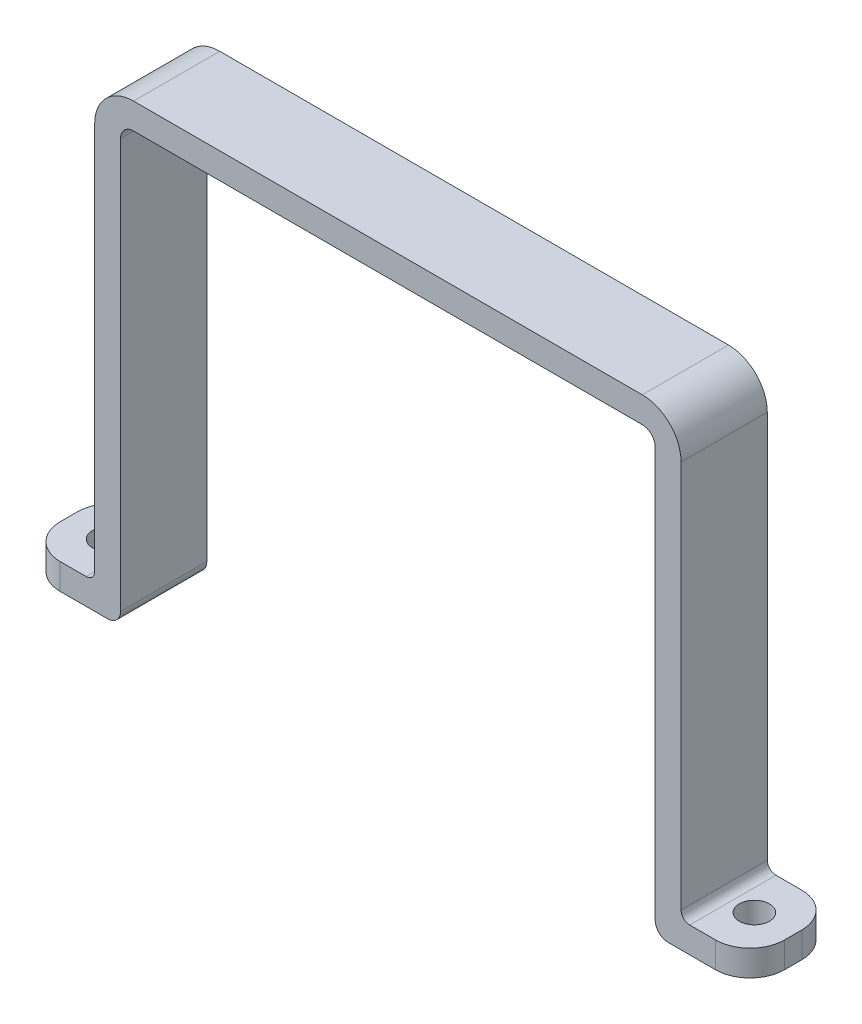
ISO-10303-21;
HEADER;
FILE_DESCRIPTION(('STEP AP214'),'2;1');
FILE_NAME('part.step','',(''),(''),'','','');
FILE_SCHEMA(('AUTOMOTIVE_DESIGN { 1 0 10303 214 1 1 1 1 }'));
ENDSEC;
DATA;
#1=APPLICATION_CONTEXT('core data for automotive mechanical design processes');
#2=APPLICATION_PROTOCOL_DEFINITION('international standard','automotive_design',2000,#1);
#3=PRODUCT_CONTEXT('',#1,'mechanical');
#4=PRODUCT('Part','Part','',(#3));
#5=PRODUCT_RELATED_PRODUCT_CATEGORY('part','',(#4));
#6=PRODUCT_DEFINITION_FORMATION('','',#4);
#7=PRODUCT_DEFINITION_CONTEXT('part definition',#1,'design');
#8=PRODUCT_DEFINITION('design','',#6,#7);
#9=PRODUCT_DEFINITION_SHAPE('','',#8);
#10=(LENGTH_UNIT() NAMED_UNIT(*) SI_UNIT(.MILLI.,.METRE.));
#11=(NAMED_UNIT(*) PLANE_ANGLE_UNIT() SI_UNIT($,.RADIAN.));
#12=(NAMED_UNIT(*) SI_UNIT($,.STERADIAN.) SOLID_ANGLE_UNIT());
#13=UNCERTAINTY_MEASURE_WITH_UNIT(LENGTH_MEASURE(1.E-05),#10,'distance_accuracy_value','');
#14=(GEOMETRIC_REPRESENTATION_CONTEXT(3) GLOBAL_UNCERTAINTY_ASSIGNED_CONTEXT((#13)) GLOBAL_UNIT_ASSIGNED_CONTEXT((#10,
#11,#12)) REPRESENTATION_CONTEXT('',''));
#15=CARTESIAN_POINT('',(0.,0.,0.));
#16=DIRECTION('',(0.,0.,1.));
#17=DIRECTION('',(1.,0.,0.));
#18=AXIS2_PLACEMENT_3D('',#15,#16,#17);
#19=CARTESIAN_POINT('',(0.,3.,5.));
#20=DIRECTION('',(1.,0.,0.));
#21=DIRECTION('',(0.,1.,0.));
#22=AXIS2_PLACEMENT_3D('',#19,#20,#21);
#23=PLANE('',#22);
#24=DIRECTION('',(0.,0.,-1.));
#25=VECTOR('',#24,1.);
#26=CARTESIAN_POINT('',(0.,3.,5.));
#27=LINE('',#26,#25);
#28=CARTESIAN_POINT('',(0.,3.,1.));
#29=VERTEX_POINT('',#28);
#30=CARTESIAN_POINT('',(0.,3.,-1.));
#31=VERTEX_POINT('',#30);
#32=EDGE_CURVE('E440',#29,#31,#27,.T.);
#33=ORIENTED_EDGE('',*,*,#32,.T.);
#34=DIRECTION('',(0.,-1.,0.));
#35=VECTOR('',#34,1.);
#36=CARTESIAN_POINT('',(0.,3.,-1.));
#37=LINE('',#36,#35);
#38=CARTESIAN_POINT('',(0.,0.,-1.));
#39=VERTEX_POINT('',#38);
#40=EDGE_CURVE('E225',#31,#39,#37,.T.);
#41=ORIENTED_EDGE('',*,*,#40,.T.);
#42=DIRECTION('',(0.,0.,-1.));
#43=VECTOR('',#42,1.);
#44=CARTESIAN_POINT('',(0.,0.,5.));
#45=LINE('',#44,#43);
#46=CARTESIAN_POINT('',(0.,0.,1.));
#47=VERTEX_POINT('',#46);
#48=EDGE_CURVE('E214',#47,#39,#45,.T.);
#49=ORIENTED_EDGE('',*,*,#48,.F.);
#50=DIRECTION('',(0.,-1.,0.));
#51=VECTOR('',#50,1.);
#52=CARTESIAN_POINT('',(0.,3.,1.));
#53=LINE('',#52,#51);
#54=EDGE_CURVE('E227',#47,#29,#53,.F.);
#55=ORIENTED_EDGE('',*,*,#54,.T.);
#56=EDGE_LOOP('',(#33,#41,#49,#55));
#57=FACE_BOUND('',#56,.T.);
#58=ADVANCED_FACE('F50',(#57),#23,.F.);
#59=CARTESIAN_POINT('',(0.,0.,5.));
#60=DIRECTION('',(0.,1.,0.));
#61=DIRECTION('',(0.,0.,1.));
#62=AXIS2_PLACEMENT_3D('',#59,#60,#61);
#63=PLANE('',#62);
#64=CARTESIAN_POINT('',(4.50000000000003,0.,0.));
#65=DIRECTION('',(0.,-1.,0.));
#66=DIRECTION('',(1.,0.,0.));
#67=AXIS2_PLACEMENT_3D('',#64,#65,#66);
#68=CIRCLE('',#67,1.75);
#69=CARTESIAN_POINT('',(6.25000000000003,0.,0.));
#70=VERTEX_POINT('',#69);
#71=EDGE_CURVE('E512',#70,#70,#68,.T.);
#72=ORIENTED_EDGE('',*,*,#71,.F.);
#73=EDGE_LOOP('',(#72));
#74=FACE_BOUND('',#73,.T.);
#75=DIRECTION('',(1.,0.,0.));
#76=VECTOR('',#75,1.);
#77=CARTESIAN_POINT('',(0.,0.,-5.));
#78=LINE('',#77,#76);
#79=CARTESIAN_POINT('',(4.,0.,-5.));
#80=VERTEX_POINT('',#79);
#81=CARTESIAN_POINT('',(9.5,0.,-5.));
#82=VERTEX_POINT('',#81);
#83=EDGE_CURVE('E491',#80,#82,#78,.T.);
#84=ORIENTED_EDGE('',*,*,#83,.T.);
#85=DIRECTION('',(0.,0.,-1.));
#86=VECTOR('',#85,1.);
#87=CARTESIAN_POINT('',(9.5,0.,5.));
#88=LINE('',#87,#86);
#89=CARTESIAN_POINT('',(9.5,0.,5.));
#90=VERTEX_POINT('',#89);
#91=EDGE_CURVE('E364',#82,#90,#88,.F.);
#92=ORIENTED_EDGE('',*,*,#91,.T.);
#93=DIRECTION('',(1.,0.,0.));
#94=VECTOR('',#93,1.);
#95=CARTESIAN_POINT('',(0.,0.,5.));
#96=LINE('',#95,#94);
#97=CARTESIAN_POINT('',(4.,0.,5.));
#98=VERTEX_POINT('',#97);
#99=EDGE_CURVE('E213',#98,#90,#96,.T.);
#100=ORIENTED_EDGE('',*,*,#99,.F.);
#101=CARTESIAN_POINT('',(4.,0.,1.));
#102=DIRECTION('',(0.,1.,0.));
#103=DIRECTION('',(0.,0.,1.));
#104=AXIS2_PLACEMENT_3D('',#101,#102,#103);
#105=CIRCLE('',#104,4.);
#106=EDGE_CURVE('E209',#98,#47,#105,.F.);
#107=ORIENTED_EDGE('',*,*,#106,.T.);
#108=ORIENTED_EDGE('',*,*,#48,.T.);
#109=CARTESIAN_POINT('',(4.,0.,-1.));
#110=DIRECTION('',(0.,1.,0.));
#111=DIRECTION('',(0.,0.,1.));
#112=AXIS2_PLACEMENT_3D('',#109,#110,#111);
#113=CIRCLE('',#112,4.);
#114=EDGE_CURVE('E223',#39,#80,#113,.F.);
#115=ORIENTED_EDGE('',*,*,#114,.T.);
#116=EDGE_LOOP('',(#84,#92,#100,#107,#108,#115));
#117=FACE_BOUND('',#116,.T.);
#118=ADVANCED_FACE('F215',(#74,#117),#63,.F.);
#119=CARTESIAN_POINT('',(11.,0.,5.));
#120=DIRECTION('',(-1.,0.,0.));
#121=DIRECTION('',(0.,0.,1.));
#122=AXIS2_PLACEMENT_3D('',#119,#120,#121);
#123=PLANE('',#122);
#124=DIRECTION('',(0.,1.,0.));
#125=VECTOR('',#124,1.);
#126=CARTESIAN_POINT('',(11.,0.,5.));
#127=LINE('',#126,#125);
#128=CARTESIAN_POINT('',(11.,1.5,5.));
#129=VERTEX_POINT('',#128);
#130=CARTESIAN_POINT('',(11.,49.,5.));
#131=VERTEX_POINT('',#130);
#132=EDGE_CURVE('E478',#129,#131,#127,.T.);
#133=ORIENTED_EDGE('',*,*,#132,.F.);
#134=DIRECTION('',(0.,0.,-1.));
#135=VECTOR('',#134,1.);
#136=CARTESIAN_POINT('',(11.,1.5,5.));
#137=LINE('',#136,#135);
#138=CARTESIAN_POINT('',(11.,1.5,-5.));
#139=VERTEX_POINT('',#138);
#140=EDGE_CURVE('E359',#129,#139,#137,.T.);
#141=ORIENTED_EDGE('',*,*,#140,.T.);
#142=DIRECTION('',(0.,1.,0.));
#143=VECTOR('',#142,1.);
#144=CARTESIAN_POINT('',(11.,0.,-5.));
#145=LINE('',#144,#143);
#146=CARTESIAN_POINT('',(11.,49.,-5.));
#147=VERTEX_POINT('',#146);
#148=EDGE_CURVE('E496',#139,#147,#145,.T.);
#149=ORIENTED_EDGE('',*,*,#148,.T.);
#150=DIRECTION('',(0.,0.,-1.));
#151=VECTOR('',#150,1.);
#152=CARTESIAN_POINT('',(11.,49.,5.));
#153=LINE('',#152,#151);
#154=EDGE_CURVE('E292',#147,#131,#153,.F.);
#155=ORIENTED_EDGE('',*,*,#154,.T.);
#156=EDGE_LOOP('',(#133,#141,#149,#155));
#157=FACE_BOUND('',#156,.T.);
#158=ADVANCED_FACE('F532',(#157),#123,.F.);
#159=CARTESIAN_POINT('',(11.,50.5,5.));
#160=DIRECTION('',(0.,1.,0.));
#161=DIRECTION('',(0.,0.,1.));
#162=AXIS2_PLACEMENT_3D('',#159,#160,#161);
#163=PLANE('',#162);
#164=DIRECTION('',(1.,0.,0.));
#165=VECTOR('',#164,1.);
#166=CARTESIAN_POINT('',(11.,50.5,5.));
#167=LINE('',#166,#165);
#168=CARTESIAN_POINT('',(12.5,50.5,5.));
#169=VERTEX_POINT('',#168);
#170=CARTESIAN_POINT('',(71.5,50.5,5.));
#171=VERTEX_POINT('',#170);
#172=EDGE_CURVE('E471',#169,#171,#167,.T.);
#173=ORIENTED_EDGE('',*,*,#172,.F.);
#174=DIRECTION('',(0.,0.,-1.));
#175=VECTOR('',#174,1.);
#176=CARTESIAN_POINT('',(12.5,50.5,-5.));
#177=LINE('',#176,#175);
#178=CARTESIAN_POINT('',(12.5,50.5,-5.));
#179=VERTEX_POINT('',#178);
#180=EDGE_CURVE('E286',#169,#179,#177,.T.);
#181=ORIENTED_EDGE('',*,*,#180,.T.);
#182=DIRECTION('',(1.,0.,0.));
#183=VECTOR('',#182,1.);
#184=CARTESIAN_POINT('',(11.,50.5,-5.));
#185=LINE('',#184,#183);
#186=CARTESIAN_POINT('',(71.5,50.5,-5.));
#187=VERTEX_POINT('',#186);
#188=EDGE_CURVE('E499',#179,#187,#185,.T.);
#189=ORIENTED_EDGE('',*,*,#188,.T.);
#190=DIRECTION('',(0.,0.,-1.));
#191=VECTOR('',#190,1.);
#192=CARTESIAN_POINT('',(71.5,50.5,5.));
#193=LINE('',#192,#191);
#194=EDGE_CURVE('E284',#187,#171,#193,.F.);
#195=ORIENTED_EDGE('',*,*,#194,.T.);
#196=EDGE_LOOP('',(#173,#181,#189,#195));
#197=FACE_BOUND('',#196,.T.);
#198=ADVANCED_FACE('F539',(#197),#163,.F.);
#199=CARTESIAN_POINT('',(73.,50.5,5.));
#200=DIRECTION('',(1.,0.,0.));
#201=DIRECTION('',(0.,0.,-1.));
#202=AXIS2_PLACEMENT_3D('',#199,#200,#201);
#203=PLANE('',#202);
#204=DIRECTION('',(0.,-1.,0.));
#205=VECTOR('',#204,1.);
#206=CARTESIAN_POINT('',(73.,50.5,-5.));
#207=LINE('',#206,#205);
#208=CARTESIAN_POINT('',(73.,49.,-5.));
#209=VERTEX_POINT('',#208);
#210=CARTESIAN_POINT('',(73.,1.5,-5.));
#211=VERTEX_POINT('',#210);
#212=EDGE_CURVE('E425',#209,#211,#207,.T.);
#213=ORIENTED_EDGE('',*,*,#212,.T.);
#214=DIRECTION('',(0.,0.,-1.));
#215=VECTOR('',#214,1.);
#216=CARTESIAN_POINT('',(73.,1.5,5.));
#217=LINE('',#216,#215);
#218=CARTESIAN_POINT('',(73.,1.5,5.));
#219=VERTEX_POINT('',#218);
#220=EDGE_CURVE('E353',#211,#219,#217,.F.);
#221=ORIENTED_EDGE('',*,*,#220,.T.);
#222=DIRECTION('',(0.,-1.,0.));
#223=VECTOR('',#222,1.);
#224=CARTESIAN_POINT('',(73.,50.5,5.));
#225=LINE('',#224,#223);
#226=CARTESIAN_POINT('',(73.,49.,5.));
#227=VERTEX_POINT('',#226);
#228=EDGE_CURVE('E469',#227,#219,#225,.T.);
#229=ORIENTED_EDGE('',*,*,#228,.F.);
#230=DIRECTION('',(0.,0.,-1.));
#231=VECTOR('',#230,1.);
#232=CARTESIAN_POINT('',(73.,49.,-5.));
#233=LINE('',#232,#231);
#234=EDGE_CURVE('E298',#227,#209,#233,.T.);
#235=ORIENTED_EDGE('',*,*,#234,.T.);
#236=EDGE_LOOP('',(#213,#221,#229,#235));
#237=FACE_BOUND('',#236,.T.);
#238=ADVANCED_FACE('F466',(#237),#203,.F.);
#239=CARTESIAN_POINT('',(73.,0.,5.));
#240=DIRECTION('',(0.,1.,0.));
#241=DIRECTION('',(0.,0.,1.));
#242=AXIS2_PLACEMENT_3D('',#239,#240,#241);
#243=PLANE('',#242);
#244=CARTESIAN_POINT('',(79.5,0.,0.));
#245=DIRECTION('',(0.,1.,0.));
#246=DIRECTION('',(-1.,0.,0.));
#247=AXIS2_PLACEMENT_3D('',#244,#245,#246);
#248=CIRCLE('',#247,1.75);
#249=CARTESIAN_POINT('',(77.75,0.,0.));
#250=VERTEX_POINT('',#249);
#251=EDGE_CURVE('E500',#250,#250,#248,.T.);
#252=ORIENTED_EDGE('',*,*,#251,.T.);
#253=EDGE_LOOP('',(#252));
#254=FACE_BOUND('',#253,.T.);
#255=DIRECTION('',(1.,0.,0.));
#256=VECTOR('',#255,1.);
#257=CARTESIAN_POINT('',(73.,0.,5.));
#258=LINE('',#257,#256);
#259=CARTESIAN_POINT('',(74.5,0.,5.));
#260=VERTEX_POINT('',#259);
#261=CARTESIAN_POINT('',(80.,0.,5.));
#262=VERTEX_POINT('',#261);
#263=EDGE_CURVE('E463',#260,#262,#258,.T.);
#264=ORIENTED_EDGE('',*,*,#263,.F.);
#265=DIRECTION('',(0.,0.,-1.));
#266=VECTOR('',#265,1.);
#267=CARTESIAN_POINT('',(74.5,0.,5.));
#268=LINE('',#267,#266);
#269=CARTESIAN_POINT('',(74.5,0.,-5.));
#270=VERTEX_POINT('',#269);
#271=EDGE_CURVE('E342',#260,#270,#268,.T.);
#272=ORIENTED_EDGE('',*,*,#271,.T.);
#273=DIRECTION('',(1.,0.,0.));
#274=VECTOR('',#273,1.);
#275=CARTESIAN_POINT('',(73.,0.,-5.));
#276=LINE('',#275,#274);
#277=CARTESIAN_POINT('',(80.,0.,-5.));
#278=VERTEX_POINT('',#277);
#279=EDGE_CURVE('E416',#270,#278,#276,.T.);
#280=ORIENTED_EDGE('',*,*,#279,.T.);
#281=CARTESIAN_POINT('',(80.,0.,-1.));
#282=DIRECTION('',(0.,1.,0.));
#283=DIRECTION('',(0.,0.,1.));
#284=AXIS2_PLACEMENT_3D('',#281,#282,#283);
#285=CIRCLE('',#284,4.);
#286=CARTESIAN_POINT('',(84.,0.,-1.));
#287=VERTEX_POINT('',#286);
#288=EDGE_CURVE('E285',#278,#287,#285,.F.);
#289=ORIENTED_EDGE('',*,*,#288,.T.);
#290=DIRECTION('',(0.,0.,-1.));
#291=VECTOR('',#290,1.);
#292=CARTESIAN_POINT('',(84.,0.,5.));
#293=LINE('',#292,#291);
#294=CARTESIAN_POINT('',(84.,0.,1.));
#295=VERTEX_POINT('',#294);
#296=EDGE_CURVE('E233',#295,#287,#293,.T.);
#297=ORIENTED_EDGE('',*,*,#296,.F.);
#298=CARTESIAN_POINT('',(80.,0.,1.));
#299=DIRECTION('',(0.,1.,0.));
#300=DIRECTION('',(0.,0.,1.));
#301=AXIS2_PLACEMENT_3D('',#298,#299,#300);
#302=CIRCLE('',#301,4.);
#303=EDGE_CURVE('E279',#295,#262,#302,.F.);
#304=ORIENTED_EDGE('',*,*,#303,.T.);
#305=EDGE_LOOP('',(#264,#272,#280,#289,#297,#304));
#306=FACE_BOUND('',#305,.T.);
#307=ADVANCED_FACE('F458',(#254,#306),#243,.F.);
#308=CARTESIAN_POINT('',(84.,0.,5.));
#309=DIRECTION('',(-1.,0.,0.));
#310=DIRECTION('',(0.,0.,1.));
#311=AXIS2_PLACEMENT_3D('',#308,#309,#310);
#312=PLANE('',#311);
#313=ORIENTED_EDGE('',*,*,#296,.T.);
#314=DIRECTION('',(0.,1.,0.));
#315=VECTOR('',#314,1.);
#316=CARTESIAN_POINT('',(84.,0.,-1.));
#317=LINE('',#316,#315);
#318=CARTESIAN_POINT('',(84.,3.,-1.));
#319=VERTEX_POINT('',#318);
#320=EDGE_CURVE('E266',#287,#319,#317,.T.);
#321=ORIENTED_EDGE('',*,*,#320,.T.);
#322=DIRECTION('',(0.,0.,-1.));
#323=VECTOR('',#322,1.);
#324=CARTESIAN_POINT('',(84.,3.,5.));
#325=LINE('',#324,#323);
#326=CARTESIAN_POINT('',(84.,3.,1.));
#327=VERTEX_POINT('',#326);
#328=EDGE_CURVE('E439',#327,#319,#325,.T.);
#329=ORIENTED_EDGE('',*,*,#328,.F.);
#330=DIRECTION('',(0.,1.,0.));
#331=VECTOR('',#330,1.);
#332=CARTESIAN_POINT('',(84.,0.,1.));
#333=LINE('',#332,#331);
#334=EDGE_CURVE('E264',#327,#295,#333,.F.);
#335=ORIENTED_EDGE('',*,*,#334,.T.);
#336=EDGE_LOOP('',(#313,#321,#329,#335));
#337=FACE_BOUND('',#336,.T.);
#338=ADVANCED_FACE('F449',(#337),#312,.F.);
#339=CARTESIAN_POINT('',(84.,3.,5.));
#340=DIRECTION('',(0.,-1.,0.));
#341=DIRECTION('',(1.,0.,0.));
#342=AXIS2_PLACEMENT_3D('',#339,#340,#341);
#343=PLANE('',#342);
#344=CARTESIAN_POINT('',(79.5,3.,0.));
#345=DIRECTION('',(0.,1.,0.));
#346=DIRECTION('',(-1.,0.,0.));
#347=AXIS2_PLACEMENT_3D('',#344,#345,#346);
#348=CIRCLE('',#347,1.75);
#349=CARTESIAN_POINT('',(77.75,3.,0.));
#350=VERTEX_POINT('',#349);
#351=EDGE_CURVE('E510',#350,#350,#348,.T.);
#352=ORIENTED_EDGE('',*,*,#351,.F.);
#353=EDGE_LOOP('',(#352));
#354=FACE_BOUND('',#353,.T.);
#355=DIRECTION('',(-1.,0.,0.));
#356=VECTOR('',#355,1.);
#357=CARTESIAN_POINT('',(84.,3.,-5.));
#358=LINE('',#357,#356);
#359=CARTESIAN_POINT('',(80.,3.,-5.));
#360=VERTEX_POINT('',#359);
#361=CARTESIAN_POINT('',(77.,3.,-5.));
#362=VERTEX_POINT('',#361);
#363=EDGE_CURVE('E411',#360,#362,#358,.T.);
#364=ORIENTED_EDGE('',*,*,#363,.T.);
#365=DIRECTION('',(0.,0.,-1.));
#366=VECTOR('',#365,1.);
#367=CARTESIAN_POINT('',(77.,3.,5.));
#368=LINE('',#367,#366);
#369=CARTESIAN_POINT('',(77.,3.,5.));
#370=VERTEX_POINT('',#369);
#371=EDGE_CURVE('E371',#362,#370,#368,.F.);
#372=ORIENTED_EDGE('',*,*,#371,.T.);
#373=DIRECTION('',(-1.,0.,0.));
#374=VECTOR('',#373,1.);
#375=CARTESIAN_POINT('',(84.,3.,5.));
#376=LINE('',#375,#374);
#377=CARTESIAN_POINT('',(80.,3.,5.));
#378=VERTEX_POINT('',#377);
#379=EDGE_CURVE('E393',#378,#370,#376,.T.);
#380=ORIENTED_EDGE('',*,*,#379,.F.);
#381=CARTESIAN_POINT('',(80.,3.,1.));
#382=DIRECTION('',(0.,-1.,0.));
#383=DIRECTION('',(1.,0.,0.));
#384=AXIS2_PLACEMENT_3D('',#381,#382,#383);
#385=CIRCLE('',#384,4.);
#386=EDGE_CURVE('E275',#378,#327,#385,.F.);
#387=ORIENTED_EDGE('',*,*,#386,.T.);
#388=ORIENTED_EDGE('',*,*,#328,.T.);
#389=CARTESIAN_POINT('',(80.,3.,-1.));
#390=DIRECTION('',(0.,-1.,0.));
#391=DIRECTION('',(1.,0.,0.));
#392=AXIS2_PLACEMENT_3D('',#389,#390,#391);
#393=CIRCLE('',#392,4.);
#394=EDGE_CURVE('E273',#319,#360,#393,.F.);
#395=ORIENTED_EDGE('',*,*,#394,.T.);
#396=EDGE_LOOP('',(#364,#372,#380,#387,#388,#395));
#397=FACE_BOUND('',#396,.T.);
#398=ADVANCED_FACE('F414',(#354,#397),#343,.F.);
#399=CARTESIAN_POINT('',(76.,3.,5.));
#400=DIRECTION('',(-1.,0.,0.));
#401=DIRECTION('',(0.,0.,1.));
#402=AXIS2_PLACEMENT_3D('',#399,#400,#401);
#403=PLANE('',#402);
#404=DIRECTION('',(0.,1.,0.));
#405=VECTOR('',#404,1.);
#406=CARTESIAN_POINT('',(76.,3.,5.));
#407=LINE('',#406,#405);
#408=CARTESIAN_POINT('',(76.,4.,5.));
#409=VERTEX_POINT('',#408);
#410=CARTESIAN_POINT('',(76.,49.,5.));
#411=VERTEX_POINT('',#410);
#412=EDGE_CURVE('E395',#409,#411,#407,.T.);
#413=ORIENTED_EDGE('',*,*,#412,.F.);
#414=DIRECTION('',(0.,0.,-1.));
#415=VECTOR('',#414,1.);
#416=CARTESIAN_POINT('',(76.,4.,-5.));
#417=LINE('',#416,#415);
#418=CARTESIAN_POINT('',(76.,4.,-5.));
#419=VERTEX_POINT('',#418);
#420=EDGE_CURVE('E370',#409,#419,#417,.T.);
#421=ORIENTED_EDGE('',*,*,#420,.T.);
#422=DIRECTION('',(0.,1.,0.));
#423=VECTOR('',#422,1.);
#424=CARTESIAN_POINT('',(76.,3.,-5.));
#425=LINE('',#424,#423);
#426=CARTESIAN_POINT('',(76.,49.,-5.));
#427=VERTEX_POINT('',#426);
#428=EDGE_CURVE('E412',#419,#427,#425,.T.);
#429=ORIENTED_EDGE('',*,*,#428,.T.);
#430=DIRECTION('',(0.,0.,-1.));
#431=VECTOR('',#430,1.);
#432=CARTESIAN_POINT('',(76.,49.,5.));
#433=LINE('',#432,#431);
#434=EDGE_CURVE('E330',#427,#411,#433,.F.);
#435=ORIENTED_EDGE('',*,*,#434,.T.);
#436=EDGE_LOOP('',(#413,#421,#429,#435));
#437=FACE_BOUND('',#436,.T.);
#438=ADVANCED_FACE('F399',(#437),#403,.F.);
#439=CARTESIAN_POINT('',(76.,53.5,5.));
#440=DIRECTION('',(0.,-1.,0.));
#441=DIRECTION('',(1.,0.,0.));
#442=AXIS2_PLACEMENT_3D('',#439,#440,#441);
#443=PLANE('',#442);
#444=DIRECTION('',(-1.,0.,0.));
#445=VECTOR('',#444,1.);
#446=CARTESIAN_POINT('',(76.,53.5,5.));
#447=LINE('',#446,#445);
#448=CARTESIAN_POINT('',(71.5,53.5,5.));
#449=VERTEX_POINT('',#448);
#450=CARTESIAN_POINT('',(12.5,53.5,5.));
#451=VERTEX_POINT('',#450);
#452=EDGE_CURVE('E404',#449,#451,#447,.T.);
#453=ORIENTED_EDGE('',*,*,#452,.F.);
#454=DIRECTION('',(0.,0.,-1.));
#455=VECTOR('',#454,1.);
#456=CARTESIAN_POINT('',(71.5,53.5,5.));
#457=LINE('',#456,#455);
#458=CARTESIAN_POINT('',(71.5,53.5,-5.));
#459=VERTEX_POINT('',#458);
#460=EDGE_CURVE('E317',#449,#459,#457,.T.);
#461=ORIENTED_EDGE('',*,*,#460,.T.);
#462=DIRECTION('',(-1.,0.,0.));
#463=VECTOR('',#462,1.);
#464=CARTESIAN_POINT('',(76.,53.5,-5.));
#465=LINE('',#464,#463);
#466=CARTESIAN_POINT('',(12.5,53.5,-5.));
#467=VERTEX_POINT('',#466);
#468=EDGE_CURVE('E422',#459,#467,#465,.T.);
#469=ORIENTED_EDGE('',*,*,#468,.T.);
#470=DIRECTION('',(0.,0.,-1.));
#471=VECTOR('',#470,1.);
#472=CARTESIAN_POINT('',(12.5,53.5,5.));
#473=LINE('',#472,#471);
#474=EDGE_CURVE('E312',#467,#451,#473,.F.);
#475=ORIENTED_EDGE('',*,*,#474,.T.);
#476=EDGE_LOOP('',(#453,#461,#469,#475));
#477=FACE_BOUND('',#476,.T.);
#478=ADVANCED_FACE('F602',(#477),#443,.F.);
#479=CARTESIAN_POINT('',(8.00000000000001,53.5,5.));
#480=DIRECTION('',(1.,0.,0.));
#481=DIRECTION('',(0.,0.,-1.));
#482=AXIS2_PLACEMENT_3D('',#479,#480,#481);
#483=PLANE('',#482);
#484=DIRECTION('',(0.,-1.,0.));
#485=VECTOR('',#484,1.);
#486=CARTESIAN_POINT('',(8.00000000000001,53.5,-5.));
#487=LINE('',#486,#485);
#488=CARTESIAN_POINT('',(8.00000000000001,49.,-5.));
#489=VERTEX_POINT('',#488);
#490=CARTESIAN_POINT('',(8.00000000000001,4.00000000000001,-5.));
#491=VERTEX_POINT('',#490);
#492=EDGE_CURVE('E431',#489,#491,#487,.T.);
#493=ORIENTED_EDGE('',*,*,#492,.T.);
#494=DIRECTION('',(0.,0.,-1.));
#495=VECTOR('',#494,1.);
#496=CARTESIAN_POINT('',(8.00000000000001,4.,5.));
#497=LINE('',#496,#495);
#498=CARTESIAN_POINT('',(8.00000000000001,4.00000000000001,5.));
#499=VERTEX_POINT('',#498);
#500=EDGE_CURVE('E68',#491,#499,#497,.F.);
#501=ORIENTED_EDGE('',*,*,#500,.T.);
#502=DIRECTION('',(0.,-1.,0.));
#503=VECTOR('',#502,1.);
#504=CARTESIAN_POINT('',(8.00000000000001,53.5,5.));
#505=LINE('',#504,#503);
#506=CARTESIAN_POINT('',(8.00000000000001,49.,5.));
#507=VERTEX_POINT('',#506);
#508=EDGE_CURVE('E486',#507,#499,#505,.T.);
#509=ORIENTED_EDGE('',*,*,#508,.F.);
#510=DIRECTION('',(0.,0.,-1.));
#511=VECTOR('',#510,1.);
#512=CARTESIAN_POINT('',(8.00000000000001,49.,5.));
#513=LINE('',#512,#511);
#514=EDGE_CURVE('E340',#507,#489,#513,.T.);
#515=ORIENTED_EDGE('',*,*,#514,.T.);
#516=EDGE_LOOP('',(#493,#501,#509,#515));
#517=FACE_BOUND('',#516,.T.);
#518=ADVANCED_FACE('F596',(#517),#483,.F.);
#519=CARTESIAN_POINT('',(8.00000000000001,3.,5.));
#520=DIRECTION('',(0.,-1.,0.));
#521=DIRECTION('',(1.,0.,0.));
#522=AXIS2_PLACEMENT_3D('',#519,#520,#521);
#523=PLANE('',#522);
#524=CARTESIAN_POINT('',(4.50000000000003,2.99999999999999,0.));
#525=DIRECTION('',(0.,-1.,0.));
#526=DIRECTION('',(1.,0.,0.));
#527=AXIS2_PLACEMENT_3D('',#524,#525,#526);
#528=CIRCLE('',#527,1.75);
#529=CARTESIAN_POINT('',(6.25000000000003,2.99999999999999,0.));
#530=VERTEX_POINT('',#529);
#531=EDGE_CURVE('E513',#530,#530,#528,.T.);
#532=ORIENTED_EDGE('',*,*,#531,.T.);
#533=EDGE_LOOP('',(#532));
#534=FACE_BOUND('',#533,.T.);
#535=DIRECTION('',(-1.,0.,0.));
#536=VECTOR('',#535,1.);
#537=CARTESIAN_POINT('',(8.00000000000001,3.,5.));
#538=LINE('',#537,#536);
#539=CARTESIAN_POINT('',(7.00000000000001,3.,5.));
#540=VERTEX_POINT('',#539);
#541=CARTESIAN_POINT('',(4.,3.,5.));
#542=VERTEX_POINT('',#541);
#543=EDGE_CURVE('E441',#540,#542,#538,.T.);
#544=ORIENTED_EDGE('',*,*,#543,.F.);
#545=DIRECTION('',(0.,0.,-1.));
#546=VECTOR('',#545,1.);
#547=CARTESIAN_POINT('',(7.00000000000001,3.,-5.));
#548=LINE('',#547,#546);
#549=CARTESIAN_POINT('',(7.00000000000001,3.,-5.));
#550=VERTEX_POINT('',#549);
#551=EDGE_CURVE('E372',#540,#550,#548,.T.);
#552=ORIENTED_EDGE('',*,*,#551,.T.);
#553=DIRECTION('',(-1.,0.,0.));
#554=VECTOR('',#553,1.);
#555=CARTESIAN_POINT('',(8.00000000000001,3.,-5.));
#556=LINE('',#555,#554);
#557=CARTESIAN_POINT('',(4.,3.,-5.));
#558=VERTEX_POINT('',#557);
#559=EDGE_CURVE('E432',#550,#558,#556,.T.);
#560=ORIENTED_EDGE('',*,*,#559,.T.);
#561=CARTESIAN_POINT('',(4.,3.,-1.));
#562=DIRECTION('',(0.,-1.,0.));
#563=DIRECTION('',(1.,0.,0.));
#564=AXIS2_PLACEMENT_3D('',#561,#562,#563);
#565=CIRCLE('',#564,4.);
#566=EDGE_CURVE('E253',#558,#31,#565,.F.);
#567=ORIENTED_EDGE('',*,*,#566,.T.);
#568=ORIENTED_EDGE('',*,*,#32,.F.);
#569=CARTESIAN_POINT('',(4.,3.,1.));
#570=DIRECTION('',(0.,-1.,0.));
#571=DIRECTION('',(1.,0.,0.));
#572=AXIS2_PLACEMENT_3D('',#569,#570,#571);
#573=CIRCLE('',#572,4.);
#574=EDGE_CURVE('E236',#29,#542,#573,.F.);
#575=ORIENTED_EDGE('',*,*,#574,.T.);
#576=EDGE_LOOP('',(#544,#552,#560,#567,#568,#575));
#577=FACE_BOUND('',#576,.T.);
#578=ADVANCED_FACE('F591',(#534,#577),#523,.F.);
#579=CARTESIAN_POINT('',(0.,0.,5.));
#580=DIRECTION('',(0.,0.,1.));
#581=DIRECTION('',(1.,0.,0.));
#582=AXIS2_PLACEMENT_3D('',#579,#580,#581);
#583=PLANE('',#582);
#584=ORIENTED_EDGE('',*,*,#228,.T.);
#585=CARTESIAN_POINT('',(74.5,1.5,5.));
#586=DIRECTION('',(0.,0.,1.));
#587=DIRECTION('',(1.,0.,0.));
#588=AXIS2_PLACEMENT_3D('',#585,#586,#587);
#589=CIRCLE('',#588,1.5);
#590=EDGE_CURVE('E357',#219,#260,#589,.T.);
#591=ORIENTED_EDGE('',*,*,#590,.T.);
#592=ORIENTED_EDGE('',*,*,#263,.T.);
#593=DIRECTION('',(0.,1.,0.));
#594=VECTOR('',#593,1.);
#595=CARTESIAN_POINT('',(80.,3.,5.));
#596=LINE('',#595,#594);
#597=EDGE_CURVE('E259',#262,#378,#596,.T.);
#598=ORIENTED_EDGE('',*,*,#597,.T.);
#599=ORIENTED_EDGE('',*,*,#379,.T.);
#600=CARTESIAN_POINT('',(77.,4.,5.));
#601=DIRECTION('',(0.,0.,1.));
#602=DIRECTION('',(1.,0.,0.));
#603=AXIS2_PLACEMENT_3D('',#600,#601,#602);
#604=CIRCLE('',#603,1.);
#605=EDGE_CURVE('E384',#370,#409,#604,.F.);
#606=ORIENTED_EDGE('',*,*,#605,.T.);
#607=ORIENTED_EDGE('',*,*,#412,.T.);
#608=CARTESIAN_POINT('',(71.5,49.,5.));
#609=DIRECTION('',(0.,0.,1.));
#610=DIRECTION('',(1.,0.,0.));
#611=AXIS2_PLACEMENT_3D('',#608,#609,#610);
#612=CIRCLE('',#611,4.5);
#613=EDGE_CURVE('E334',#411,#449,#612,.T.);
#614=ORIENTED_EDGE('',*,*,#613,.T.);
#615=ORIENTED_EDGE('',*,*,#452,.T.);
#616=CARTESIAN_POINT('',(12.5,49.,5.));
#617=DIRECTION('',(0.,0.,1.));
#618=DIRECTION('',(1.,0.,0.));
#619=AXIS2_PLACEMENT_3D('',#616,#617,#618);
#620=CIRCLE('',#619,4.5);
#621=EDGE_CURVE('E333',#451,#507,#620,.T.);
#622=ORIENTED_EDGE('',*,*,#621,.T.);
#623=ORIENTED_EDGE('',*,*,#508,.T.);
#624=CARTESIAN_POINT('',(7.00000000000001,4.,5.));
#625=DIRECTION('',(0.,0.,1.));
#626=DIRECTION('',(1.,0.,0.));
#627=AXIS2_PLACEMENT_3D('',#624,#625,#626);
#628=CIRCLE('',#627,1.);
#629=EDGE_CURVE('E11',#499,#540,#628,.F.);
#630=ORIENTED_EDGE('',*,*,#629,.T.);
#631=ORIENTED_EDGE('',*,*,#543,.T.);
#632=DIRECTION('',(0.,-1.,0.));
#633=VECTOR('',#632,1.);
#634=CARTESIAN_POINT('',(4.,0.,5.));
#635=LINE('',#634,#633);
#636=EDGE_CURVE('E265',#542,#98,#635,.T.);
#637=ORIENTED_EDGE('',*,*,#636,.T.);
#638=ORIENTED_EDGE('',*,*,#99,.T.);
#639=CARTESIAN_POINT('',(9.5,1.5,5.));
#640=DIRECTION('',(0.,0.,1.));
#641=DIRECTION('',(1.,0.,0.));
#642=AXIS2_PLACEMENT_3D('',#639,#640,#641);
#643=CIRCLE('',#642,1.5);
#644=EDGE_CURVE('E354',#90,#129,#643,.T.);
#645=ORIENTED_EDGE('',*,*,#644,.T.);
#646=ORIENTED_EDGE('',*,*,#132,.T.);
#647=CARTESIAN_POINT('',(12.5,49.,5.));
#648=DIRECTION('',(0.,0.,1.));
#649=DIRECTION('',(1.,0.,0.));
#650=AXIS2_PLACEMENT_3D('',#647,#648,#649);
#651=CIRCLE('',#650,1.5);
#652=EDGE_CURVE('E302',#131,#169,#651,.F.);
#653=ORIENTED_EDGE('',*,*,#652,.T.);
#654=ORIENTED_EDGE('',*,*,#172,.T.);
#655=CARTESIAN_POINT('',(71.5,49.,5.));
#656=DIRECTION('',(0.,0.,1.));
#657=DIRECTION('',(1.,0.,0.));
#658=AXIS2_PLACEMENT_3D('',#655,#656,#657);
#659=CIRCLE('',#658,1.5);
#660=EDGE_CURVE('E309',#171,#227,#659,.F.);
#661=ORIENTED_EDGE('',*,*,#660,.T.);
#662=EDGE_LOOP('',(#584,#591,#592,#598,#599,#606,#607,#614,#615,#622,#623,#630,#631,#637,#638,
#645,#646,#653,#654,#661));
#663=FACE_BOUND('',#662,.T.);
#664=ADVANCED_FACE('F391',(#663),#583,.T.);
#665=CARTESIAN_POINT('',(0.,0.,-5.));
#666=DIRECTION('',(0.,0.,1.));
#667=DIRECTION('',(1.,0.,0.));
#668=AXIS2_PLACEMENT_3D('',#665,#666,#667);
#669=PLANE('',#668);
#670=ORIENTED_EDGE('',*,*,#279,.F.);
#671=CARTESIAN_POINT('',(74.5,1.5,-5.));
#672=DIRECTION('',(0.,0.,1.));
#673=DIRECTION('',(1.,0.,0.));
#674=AXIS2_PLACEMENT_3D('',#671,#672,#673);
#675=CIRCLE('',#674,1.5);
#676=EDGE_CURVE('E347',#270,#211,#675,.F.);
#677=ORIENTED_EDGE('',*,*,#676,.T.);
#678=ORIENTED_EDGE('',*,*,#212,.F.);
#679=CARTESIAN_POINT('',(71.5,49.,-5.));
#680=DIRECTION('',(0.,0.,1.));
#681=DIRECTION('',(1.,0.,0.));
#682=AXIS2_PLACEMENT_3D('',#679,#680,#681);
#683=CIRCLE('',#682,1.5);
#684=EDGE_CURVE('E310',#209,#187,#683,.T.);
#685=ORIENTED_EDGE('',*,*,#684,.T.);
#686=ORIENTED_EDGE('',*,*,#188,.F.);
#687=CARTESIAN_POINT('',(12.5,49.,-5.));
#688=DIRECTION('',(0.,0.,1.));
#689=DIRECTION('',(1.,0.,0.));
#690=AXIS2_PLACEMENT_3D('',#687,#688,#689);
#691=CIRCLE('',#690,1.5);
#692=EDGE_CURVE('E297',#179,#147,#691,.T.);
#693=ORIENTED_EDGE('',*,*,#692,.T.);
#694=ORIENTED_EDGE('',*,*,#148,.F.);
#695=CARTESIAN_POINT('',(9.5,1.5,-5.));
#696=DIRECTION('',(0.,0.,1.));
#697=DIRECTION('',(1.,0.,0.));
#698=AXIS2_PLACEMENT_3D('',#695,#696,#697);
#699=CIRCLE('',#698,1.5);
#700=EDGE_CURVE('E343',#139,#82,#699,.F.);
#701=ORIENTED_EDGE('',*,*,#700,.T.);
#702=ORIENTED_EDGE('',*,*,#83,.F.);
#703=DIRECTION('',(0.,-1.,0.));
#704=VECTOR('',#703,1.);
#705=CARTESIAN_POINT('',(4.,0.,-5.));
#706=LINE('',#705,#704);
#707=EDGE_CURVE('E248',#80,#558,#706,.F.);
#708=ORIENTED_EDGE('',*,*,#707,.T.);
#709=ORIENTED_EDGE('',*,*,#559,.F.);
#710=CARTESIAN_POINT('',(7.00000000000001,4.,-5.));
#711=DIRECTION('',(0.,0.,1.));
#712=DIRECTION('',(1.,0.,0.));
#713=AXIS2_PLACEMENT_3D('',#710,#711,#712);
#714=CIRCLE('',#713,1.);
#715=EDGE_CURVE('E57',#550,#491,#714,.T.);
#716=ORIENTED_EDGE('',*,*,#715,.T.);
#717=ORIENTED_EDGE('',*,*,#492,.F.);
#718=CARTESIAN_POINT('',(12.5,49.,-5.));
#719=DIRECTION('',(0.,0.,1.));
#720=DIRECTION('',(1.,0.,0.));
#721=AXIS2_PLACEMENT_3D('',#718,#719,#720);
#722=CIRCLE('',#721,4.5);
#723=EDGE_CURVE('E318',#489,#467,#722,.F.);
#724=ORIENTED_EDGE('',*,*,#723,.T.);
#725=ORIENTED_EDGE('',*,*,#468,.F.);
#726=CARTESIAN_POINT('',(71.5,49.,-5.));
#727=DIRECTION('',(0.,0.,1.));
#728=DIRECTION('',(1.,0.,0.));
#729=AXIS2_PLACEMENT_3D('',#726,#727,#728);
#730=CIRCLE('',#729,4.5);
#731=EDGE_CURVE('E324',#459,#427,#730,.F.);
#732=ORIENTED_EDGE('',*,*,#731,.T.);
#733=ORIENTED_EDGE('',*,*,#428,.F.);
#734=CARTESIAN_POINT('',(77.,4.,-5.));
#735=DIRECTION('',(0.,0.,1.));
#736=DIRECTION('',(1.,0.,0.));
#737=AXIS2_PLACEMENT_3D('',#734,#735,#736);
#738=CIRCLE('',#737,1.);
#739=EDGE_CURVE('E379',#419,#362,#738,.T.);
#740=ORIENTED_EDGE('',*,*,#739,.T.);
#741=ORIENTED_EDGE('',*,*,#363,.F.);
#742=DIRECTION('',(0.,1.,0.));
#743=VECTOR('',#742,1.);
#744=CARTESIAN_POINT('',(80.,0.,-5.));
#745=LINE('',#744,#743);
#746=EDGE_CURVE('E244',#360,#278,#745,.F.);
#747=ORIENTED_EDGE('',*,*,#746,.T.);
#748=EDGE_LOOP('',(#670,#677,#678,#685,#686,#693,#694,#701,#702,#708,#709,#716,#717,#724,#725,
#732,#733,#740,#741,#747));
#749=FACE_BOUND('',#748,.T.);
#750=ADVANCED_FACE('F408',(#749),#669,.F.);
#751=CARTESIAN_POINT('',(4.,3.,-1.));
#752=DIRECTION('',(0.,-1.,0.));
#753=DIRECTION('',(1.,0.,0.));
#754=AXIS2_PLACEMENT_3D('',#751,#752,#753);
#755=CYLINDRICAL_SURFACE('',#754,4.);
#756=ORIENTED_EDGE('',*,*,#566,.F.);
#757=ORIENTED_EDGE('',*,*,#707,.F.);
#758=ORIENTED_EDGE('',*,*,#114,.F.);
#759=ORIENTED_EDGE('',*,*,#40,.F.);
#760=EDGE_LOOP('',(#756,#757,#758,#759));
#761=FACE_BOUND('',#760,.T.);
#762=ADVANCED_FACE('F564',(#761),#755,.T.);
#763=CARTESIAN_POINT('',(4.,0.,1.));
#764=DIRECTION('',(0.,1.,0.));
#765=DIRECTION('',(-1.,0.,0.));
#766=AXIS2_PLACEMENT_3D('',#763,#764,#765);
#767=CYLINDRICAL_SURFACE('',#766,4.);
#768=ORIENTED_EDGE('',*,*,#574,.F.);
#769=ORIENTED_EDGE('',*,*,#54,.F.);
#770=ORIENTED_EDGE('',*,*,#106,.F.);
#771=ORIENTED_EDGE('',*,*,#636,.F.);
#772=EDGE_LOOP('',(#768,#769,#770,#771));
#773=FACE_BOUND('',#772,.T.);
#774=ADVANCED_FACE('F234',(#773),#767,.T.);
#775=CARTESIAN_POINT('',(80.,0.,-1.));
#776=DIRECTION('',(0.,1.,0.));
#777=DIRECTION('',(0.,0.,1.));
#778=AXIS2_PLACEMENT_3D('',#775,#776,#777);
#779=CYLINDRICAL_SURFACE('',#778,4.);
#780=ORIENTED_EDGE('',*,*,#288,.F.);
#781=ORIENTED_EDGE('',*,*,#746,.F.);
#782=ORIENTED_EDGE('',*,*,#394,.F.);
#783=ORIENTED_EDGE('',*,*,#320,.F.);
#784=EDGE_LOOP('',(#780,#781,#782,#783));
#785=FACE_BOUND('',#784,.T.);
#786=ADVANCED_FACE('F453',(#785),#779,.T.);
#787=CARTESIAN_POINT('',(80.,0.,1.));
#788=DIRECTION('',(0.,-1.,0.));
#789=DIRECTION('',(0.,0.,-1.));
#790=AXIS2_PLACEMENT_3D('',#787,#788,#789);
#791=CYLINDRICAL_SURFACE('',#790,4.);
#792=ORIENTED_EDGE('',*,*,#303,.F.);
#793=ORIENTED_EDGE('',*,*,#334,.F.);
#794=ORIENTED_EDGE('',*,*,#386,.F.);
#795=ORIENTED_EDGE('',*,*,#597,.F.);
#796=EDGE_LOOP('',(#792,#793,#794,#795));
#797=FACE_BOUND('',#796,.T.);
#798=ADVANCED_FACE('F572',(#797),#791,.T.);
#799=CARTESIAN_POINT('',(79.5,0.,0.));
#800=DIRECTION('',(0.,1.,0.));
#801=DIRECTION('',(-1.,0.,0.));
#802=AXIS2_PLACEMENT_3D('',#799,#800,#801);
#803=CYLINDRICAL_SURFACE('',#802,1.75);
#804=ORIENTED_EDGE('',*,*,#251,.F.);
#805=EDGE_LOOP('',(#804));
#806=FACE_BOUND('',#805,.T.);
#807=ORIENTED_EDGE('',*,*,#351,.T.);
#808=EDGE_LOOP('',(#807));
#809=FACE_BOUND('',#808,.T.);
#810=ADVANCED_FACE('F574',(#806,#809),#803,.F.);
#811=CARTESIAN_POINT('',(4.50000000000003,0.,0.));
#812=DIRECTION('',(0.,1.,0.));
#813=DIRECTION('',(-1.,0.,0.));
#814=AXIS2_PLACEMENT_3D('',#811,#812,#813);
#815=CYLINDRICAL_SURFACE('',#814,1.75);
#816=ORIENTED_EDGE('',*,*,#71,.T.);
#817=EDGE_LOOP('',(#816));
#818=FACE_BOUND('',#817,.T.);
#819=ORIENTED_EDGE('',*,*,#531,.F.);
#820=EDGE_LOOP('',(#819));
#821=FACE_BOUND('',#820,.T.);
#822=ADVANCED_FACE('F551',(#818,#821),#815,.F.);
#823=CARTESIAN_POINT('',(12.5,49.,5.));
#824=DIRECTION('',(0.,0.,1.));
#825=DIRECTION('',(1.,0.,0.));
#826=AXIS2_PLACEMENT_3D('',#823,#824,#825);
#827=CYLINDRICAL_SURFACE('',#826,1.5);
#828=ORIENTED_EDGE('',*,*,#652,.F.);
#829=ORIENTED_EDGE('',*,*,#154,.F.);
#830=ORIENTED_EDGE('',*,*,#692,.F.);
#831=ORIENTED_EDGE('',*,*,#180,.F.);
#832=EDGE_LOOP('',(#828,#829,#830,#831));
#833=FACE_BOUND('',#832,.T.);
#834=ADVANCED_FACE('F533',(#833),#827,.F.);
#835=CARTESIAN_POINT('',(71.5,49.,5.));
#836=DIRECTION('',(0.,0.,1.));
#837=DIRECTION('',(1.,0.,0.));
#838=AXIS2_PLACEMENT_3D('',#835,#836,#837);
#839=CYLINDRICAL_SURFACE('',#838,1.5);
#840=ORIENTED_EDGE('',*,*,#660,.F.);
#841=ORIENTED_EDGE('',*,*,#194,.F.);
#842=ORIENTED_EDGE('',*,*,#684,.F.);
#843=ORIENTED_EDGE('',*,*,#234,.F.);
#844=EDGE_LOOP('',(#840,#841,#842,#843));
#845=FACE_BOUND('',#844,.T.);
#846=ADVANCED_FACE('F541',(#845),#839,.F.);
#847=CARTESIAN_POINT('',(71.5,49.,5.));
#848=DIRECTION('',(0.,0.,-1.));
#849=DIRECTION('',(-1.,0.,0.));
#850=AXIS2_PLACEMENT_3D('',#847,#848,#849);
#851=CYLINDRICAL_SURFACE('',#850,4.5);
#852=ORIENTED_EDGE('',*,*,#613,.F.);
#853=ORIENTED_EDGE('',*,*,#434,.F.);
#854=ORIENTED_EDGE('',*,*,#731,.F.);
#855=ORIENTED_EDGE('',*,*,#460,.F.);
#856=EDGE_LOOP('',(#852,#853,#854,#855));
#857=FACE_BOUND('',#856,.T.);
#858=ADVANCED_FACE('F542',(#857),#851,.T.);
#859=CARTESIAN_POINT('',(12.5,49.,5.));
#860=DIRECTION('',(0.,0.,-1.));
#861=DIRECTION('',(-1.,0.,0.));
#862=AXIS2_PLACEMENT_3D('',#859,#860,#861);
#863=CYLINDRICAL_SURFACE('',#862,4.5);
#864=ORIENTED_EDGE('',*,*,#621,.F.);
#865=ORIENTED_EDGE('',*,*,#474,.F.);
#866=ORIENTED_EDGE('',*,*,#723,.F.);
#867=ORIENTED_EDGE('',*,*,#514,.F.);
#868=EDGE_LOOP('',(#864,#865,#866,#867));
#869=FACE_BOUND('',#868,.T.);
#870=ADVANCED_FACE('F547',(#869),#863,.T.);
#871=CARTESIAN_POINT('',(74.5,1.5,5.));
#872=DIRECTION('',(0.,0.,-1.));
#873=DIRECTION('',(-1.,0.,0.));
#874=AXIS2_PLACEMENT_3D('',#871,#872,#873);
#875=CYLINDRICAL_SURFACE('',#874,1.5);
#876=ORIENTED_EDGE('',*,*,#590,.F.);
#877=ORIENTED_EDGE('',*,*,#220,.F.);
#878=ORIENTED_EDGE('',*,*,#676,.F.);
#879=ORIENTED_EDGE('',*,*,#271,.F.);
#880=EDGE_LOOP('',(#876,#877,#878,#879));
#881=FACE_BOUND('',#880,.T.);
#882=ADVANCED_FACE('F464',(#881),#875,.T.);
#883=CARTESIAN_POINT('',(9.5,1.5,5.));
#884=DIRECTION('',(0.,0.,-1.));
#885=DIRECTION('',(-1.,0.,0.));
#886=AXIS2_PLACEMENT_3D('',#883,#884,#885);
#887=CYLINDRICAL_SURFACE('',#886,1.5);
#888=ORIENTED_EDGE('',*,*,#644,.F.);
#889=ORIENTED_EDGE('',*,*,#91,.F.);
#890=ORIENTED_EDGE('',*,*,#700,.F.);
#891=ORIENTED_EDGE('',*,*,#140,.F.);
#892=EDGE_LOOP('',(#888,#889,#890,#891));
#893=FACE_BOUND('',#892,.T.);
#894=ADVANCED_FACE('F642',(#893),#887,.T.);
#895=CARTESIAN_POINT('',(77.,4.,5.));
#896=DIRECTION('',(0.,0.,1.));
#897=DIRECTION('',(1.,0.,0.));
#898=AXIS2_PLACEMENT_3D('',#895,#896,#897);
#899=CYLINDRICAL_SURFACE('',#898,1.);
#900=ORIENTED_EDGE('',*,*,#605,.F.);
#901=ORIENTED_EDGE('',*,*,#371,.F.);
#902=ORIENTED_EDGE('',*,*,#739,.F.);
#903=ORIENTED_EDGE('',*,*,#420,.F.);
#904=EDGE_LOOP('',(#900,#901,#902,#903));
#905=FACE_BOUND('',#904,.T.);
#906=ADVANCED_FACE('F407',(#905),#899,.F.);
#907=CARTESIAN_POINT('',(7.00000000000001,4.,5.));
#908=DIRECTION('',(0.,0.,1.));
#909=DIRECTION('',(1.,0.,0.));
#910=AXIS2_PLACEMENT_3D('',#907,#908,#909);
#911=CYLINDRICAL_SURFACE('',#910,1.);
#912=ORIENTED_EDGE('',*,*,#629,.F.);
#913=ORIENTED_EDGE('',*,*,#500,.F.);
#914=ORIENTED_EDGE('',*,*,#715,.F.);
#915=ORIENTED_EDGE('',*,*,#551,.F.);
#916=EDGE_LOOP('',(#912,#913,#914,#915));
#917=FACE_BOUND('',#916,.T.);
#918=ADVANCED_FACE('F47',(#917),#911,.F.);
#919=CLOSED_SHELL('',(#58,#118,#158,#198,#238,#307,#338,#398,#438,#478,#518,#578,#664,#750,#762,
#774,#786,#798,#810,#822,#834,#846,#858,#870,#882,#894,#906,#918));
#920=MANIFOLD_SOLID_BREP('B2',#919);
#921=ADVANCED_BREP_SHAPE_REPRESENTATION('',(#18,#920),#14);
#922=SHAPE_DEFINITION_REPRESENTATION(#9,#921);
ENDSEC;
END-ISO-10303-21;
